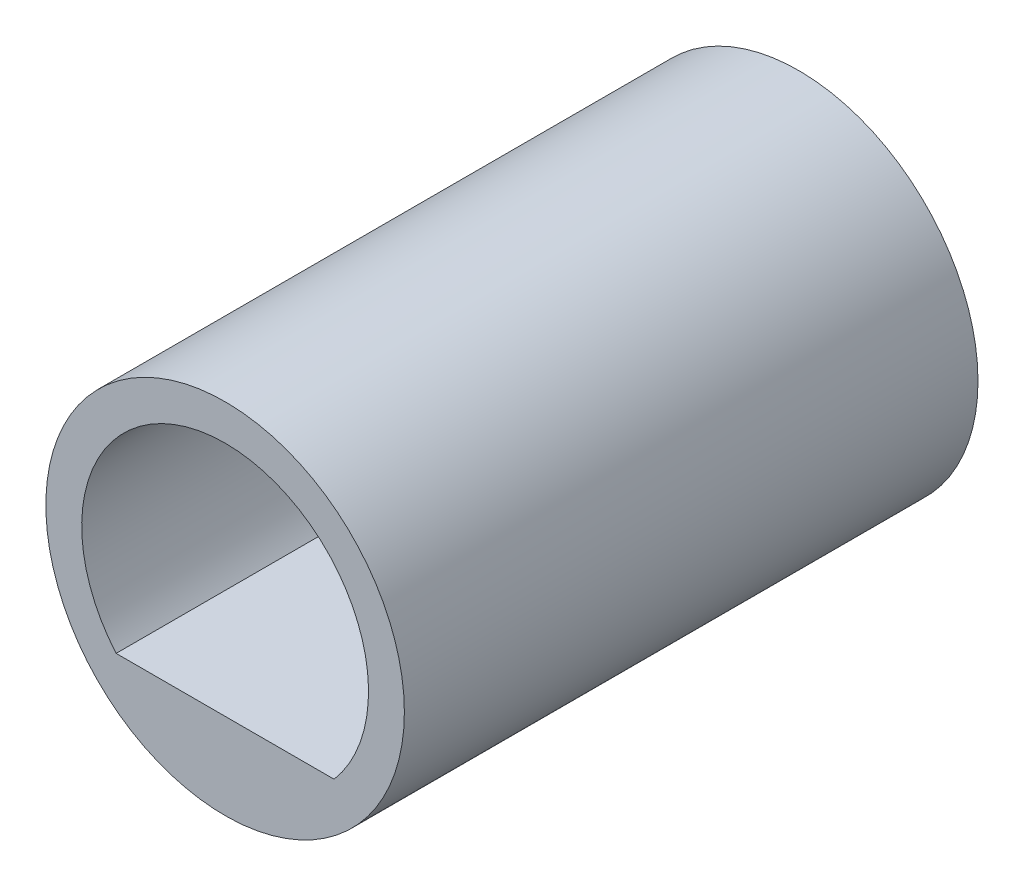
ISO-10303-21;
HEADER;
FILE_DESCRIPTION(('STEP AP214'),'2;1');
FILE_NAME('part.step','',(''),(''),'','','');
FILE_SCHEMA(('AUTOMOTIVE_DESIGN { 1 0 10303 214 1 1 1 1 }'));
ENDSEC;
DATA;
#1=APPLICATION_CONTEXT('core data for automotive mechanical design processes');
#2=APPLICATION_PROTOCOL_DEFINITION('international standard','automotive_design',2000,#1);
#3=PRODUCT_CONTEXT('',#1,'mechanical');
#4=PRODUCT('Part','Part','',(#3));
#5=PRODUCT_RELATED_PRODUCT_CATEGORY('part','',(#4));
#6=PRODUCT_DEFINITION_FORMATION('','',#4);
#7=PRODUCT_DEFINITION_CONTEXT('part definition',#1,'design');
#8=PRODUCT_DEFINITION('design','',#6,#7);
#9=PRODUCT_DEFINITION_SHAPE('','',#8);
#10=(LENGTH_UNIT() NAMED_UNIT(*) SI_UNIT(.MILLI.,.METRE.));
#11=(NAMED_UNIT(*) PLANE_ANGLE_UNIT() SI_UNIT($,.RADIAN.));
#12=(NAMED_UNIT(*) SI_UNIT($,.STERADIAN.) SOLID_ANGLE_UNIT());
#13=UNCERTAINTY_MEASURE_WITH_UNIT(LENGTH_MEASURE(1.E-05),#10,'distance_accuracy_value','');
#14=(GEOMETRIC_REPRESENTATION_CONTEXT(3) GLOBAL_UNCERTAINTY_ASSIGNED_CONTEXT((#13)) GLOBAL_UNIT_ASSIGNED_CONTEXT((#10,
#11,#12)) REPRESENTATION_CONTEXT('',''));
#15=CARTESIAN_POINT('',(0.,0.,0.));
#16=DIRECTION('',(0.,0.,1.));
#17=DIRECTION('',(1.,0.,0.));
#18=AXIS2_PLACEMENT_3D('',#15,#16,#17);
#19=CARTESIAN_POINT('',(0.,0.,8.));
#20=DIRECTION('',(0.,0.,1.));
#21=DIRECTION('',(1.,0.,0.));
#22=AXIS2_PLACEMENT_3D('',#19,#20,#21);
#23=PLANE('',#22);
#24=CARTESIAN_POINT('',(0.,0.,8.));
#25=DIRECTION('',(0.,0.,1.));
#26=DIRECTION('',(1.,0.,0.));
#27=AXIS2_PLACEMENT_3D('',#24,#25,#26);
#28=CIRCLE('',#27,2.5);
#29=CARTESIAN_POINT('',(2.5,0.,8.));
#30=VERTEX_POINT('',#29);
#31=EDGE_CURVE('E11',#30,#30,#28,.T.);
#32=ORIENTED_EDGE('',*,*,#31,.T.);
#33=EDGE_LOOP('',(#32));
#34=FACE_BOUND('',#33,.T.);
#35=DIRECTION('',(1.,0.,0.));
#36=VECTOR('',#35,1.);
#37=CARTESIAN_POINT('',(-1.51986841535707,-1.3,8.));
#38=LINE('',#37,#36);
#39=CARTESIAN_POINT('',(-1.51986841535707,-1.3,8.));
#40=VERTEX_POINT('',#39);
#41=CARTESIAN_POINT('',(1.51986841535707,-1.3,8.));
#42=VERTEX_POINT('',#41);
#43=EDGE_CURVE('E72',#40,#42,#38,.T.);
#44=ORIENTED_EDGE('',*,*,#43,.F.);
#45=CARTESIAN_POINT('',(0.,0.,8.));
#46=DIRECTION('',(0.,0.,1.));
#47=DIRECTION('',(1.,0.,0.));
#48=AXIS2_PLACEMENT_3D('',#45,#46,#47);
#49=CIRCLE('',#48,2.);
#50=EDGE_CURVE('E63',#42,#40,#49,.T.);
#51=ORIENTED_EDGE('',*,*,#50,.F.);
#52=EDGE_LOOP('',(#44,#51));
#53=FACE_BOUND('',#52,.T.);
#54=ADVANCED_FACE('F31',(#34,#53),#23,.T.);
#55=CARTESIAN_POINT('',(0.,0.,0.));
#56=DIRECTION('',(0.,0.,1.));
#57=DIRECTION('',(1.,0.,0.));
#58=AXIS2_PLACEMENT_3D('',#55,#56,#57);
#59=PLANE('',#58);
#60=CARTESIAN_POINT('',(0.,0.,0.));
#61=DIRECTION('',(0.,0.,1.));
#62=DIRECTION('',(1.,0.,0.));
#63=AXIS2_PLACEMENT_3D('',#60,#61,#62);
#64=CIRCLE('',#63,2.5);
#65=CARTESIAN_POINT('',(2.5,0.,0.));
#66=VERTEX_POINT('',#65);
#67=EDGE_CURVE('E35',#66,#66,#64,.T.);
#68=ORIENTED_EDGE('',*,*,#67,.F.);
#69=EDGE_LOOP('',(#68));
#70=FACE_BOUND('',#69,.T.);
#71=CARTESIAN_POINT('',(0.,0.,0.));
#72=DIRECTION('',(0.,0.,1.));
#73=DIRECTION('',(1.,0.,0.));
#74=AXIS2_PLACEMENT_3D('',#71,#72,#73);
#75=CIRCLE('',#74,2.);
#76=CARTESIAN_POINT('',(1.51986841535707,-1.3,0.));
#77=VERTEX_POINT('',#76);
#78=CARTESIAN_POINT('',(-1.51986841535707,-1.3,0.));
#79=VERTEX_POINT('',#78);
#80=EDGE_CURVE('E53',#77,#79,#75,.T.);
#81=ORIENTED_EDGE('',*,*,#80,.T.);
#82=DIRECTION('',(1.,0.,0.));
#83=VECTOR('',#82,1.);
#84=CARTESIAN_POINT('',(-1.51986841535707,-1.3,0.));
#85=LINE('',#84,#83);
#86=EDGE_CURVE('E59',#79,#77,#85,.T.);
#87=ORIENTED_EDGE('',*,*,#86,.T.);
#88=EDGE_LOOP('',(#81,#87));
#89=FACE_BOUND('',#88,.T.);
#90=ADVANCED_FACE('F69',(#70,#89),#59,.F.);
#91=CARTESIAN_POINT('',(0.,0.,8.));
#92=DIRECTION('',(0.,0.,-1.));
#93=DIRECTION('',(-1.,0.,0.));
#94=AXIS2_PLACEMENT_3D('',#91,#92,#93);
#95=CYLINDRICAL_SURFACE('',#94,2.5);
#96=ORIENTED_EDGE('',*,*,#31,.F.);
#97=EDGE_LOOP('',(#96));
#98=FACE_BOUND('',#97,.T.);
#99=ORIENTED_EDGE('',*,*,#67,.T.);
#100=EDGE_LOOP('',(#99));
#101=FACE_BOUND('',#100,.T.);
#102=ADVANCED_FACE('F33',(#98,#101),#95,.T.);
#103=CARTESIAN_POINT('',(0.,0.,8.));
#104=DIRECTION('',(0.,0.,-1.));
#105=DIRECTION('',(-1.,0.,0.));
#106=AXIS2_PLACEMENT_3D('',#103,#104,#105);
#107=CYLINDRICAL_SURFACE('',#106,2.);
#108=ORIENTED_EDGE('',*,*,#80,.F.);
#109=DIRECTION('',(0.,0.,-1.));
#110=VECTOR('',#109,1.);
#111=CARTESIAN_POINT('',(1.51986841535707,-1.3,8.));
#112=LINE('',#111,#110);
#113=EDGE_CURVE('E61',#42,#77,#112,.T.);
#114=ORIENTED_EDGE('',*,*,#113,.F.);
#115=ORIENTED_EDGE('',*,*,#50,.T.);
#116=DIRECTION('',(0.,0.,-1.));
#117=VECTOR('',#116,1.);
#118=CARTESIAN_POINT('',(-1.51986841535707,-1.3,8.));
#119=LINE('',#118,#117);
#120=EDGE_CURVE('E46',#40,#79,#119,.T.);
#121=ORIENTED_EDGE('',*,*,#120,.T.);
#122=EDGE_LOOP('',(#108,#114,#115,#121));
#123=FACE_BOUND('',#122,.T.);
#124=ADVANCED_FACE('F65',(#123),#107,.F.);
#125=CARTESIAN_POINT('',(-1.51986841535707,-1.3,8.));
#126=DIRECTION('',(0.,1.,0.));
#127=DIRECTION('',(0.,0.,1.));
#128=AXIS2_PLACEMENT_3D('',#125,#126,#127);
#129=PLANE('',#128);
#130=ORIENTED_EDGE('',*,*,#86,.F.);
#131=ORIENTED_EDGE('',*,*,#120,.F.);
#132=ORIENTED_EDGE('',*,*,#43,.T.);
#133=ORIENTED_EDGE('',*,*,#113,.T.);
#134=EDGE_LOOP('',(#130,#131,#132,#133));
#135=FACE_BOUND('',#134,.T.);
#136=ADVANCED_FACE('F60',(#135),#129,.T.);
#137=CLOSED_SHELL('',(#54,#90,#102,#124,#136));
#138=MANIFOLD_SOLID_BREP('B2',#137);
#139=ADVANCED_BREP_SHAPE_REPRESENTATION('',(#18,#138),#14);
#140=SHAPE_DEFINITION_REPRESENTATION(#9,#139);
ENDSEC;
END-ISO-10303-21;
